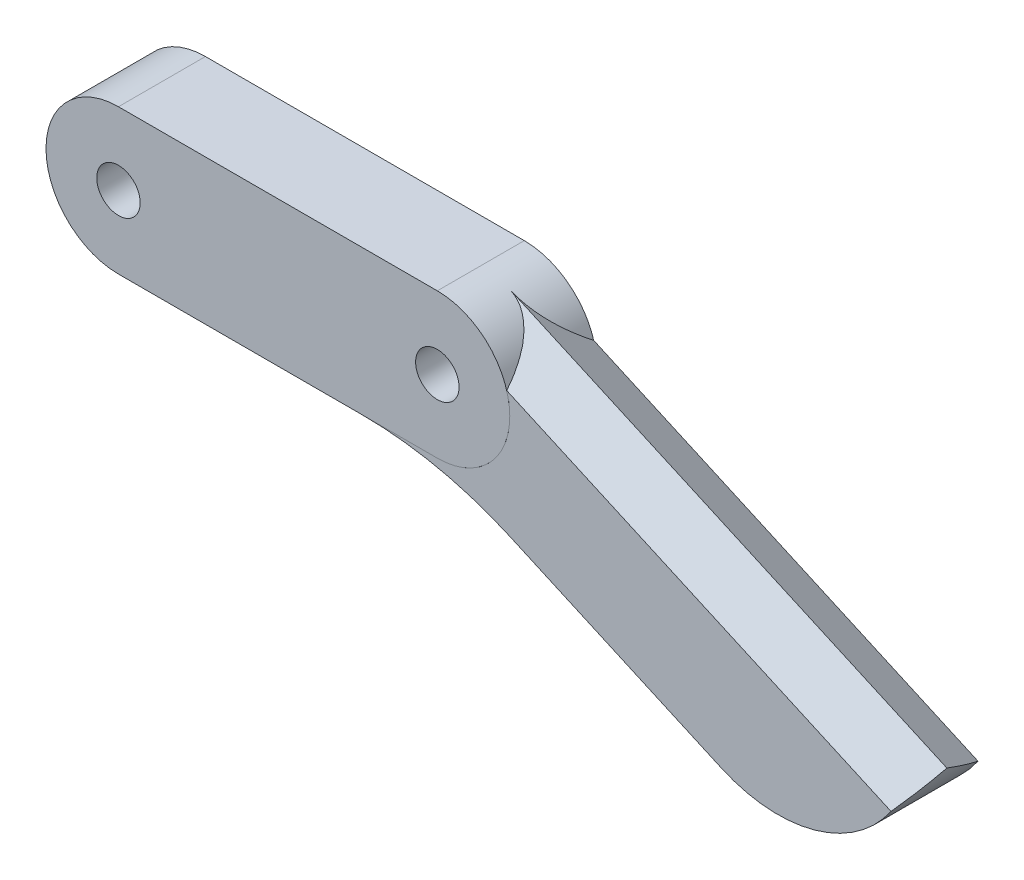
ISO-10303-21;
HEADER;
FILE_DESCRIPTION(('STEP AP214'),'2;1');
FILE_NAME('part.step','',(''),(''),'','','');
FILE_SCHEMA(('AUTOMOTIVE_DESIGN { 1 0 10303 214 1 1 1 1 }'));
ENDSEC;
DATA;
#1=APPLICATION_CONTEXT('core data for automotive mechanical design processes');
#2=APPLICATION_PROTOCOL_DEFINITION('international standard','automotive_design',2000,#1);
#3=PRODUCT_CONTEXT('',#1,'mechanical');
#4=PRODUCT('Part','Part','',(#3));
#5=PRODUCT_RELATED_PRODUCT_CATEGORY('part','',(#4));
#6=PRODUCT_DEFINITION_FORMATION('','',#4);
#7=PRODUCT_DEFINITION_CONTEXT('part definition',#1,'design');
#8=PRODUCT_DEFINITION('design','',#6,#7);
#9=PRODUCT_DEFINITION_SHAPE('','',#8);
#10=(LENGTH_UNIT() NAMED_UNIT(*) SI_UNIT(.MILLI.,.METRE.));
#11=(NAMED_UNIT(*) PLANE_ANGLE_UNIT() SI_UNIT($,.RADIAN.));
#12=(NAMED_UNIT(*) SI_UNIT($,.STERADIAN.) SOLID_ANGLE_UNIT());
#13=UNCERTAINTY_MEASURE_WITH_UNIT(LENGTH_MEASURE(1.E-05),#10,'distance_accuracy_value','');
#14=(GEOMETRIC_REPRESENTATION_CONTEXT(3) GLOBAL_UNCERTAINTY_ASSIGNED_CONTEXT((#13)) GLOBAL_UNIT_ASSIGNED_CONTEXT((#10,
#11,#12)) REPRESENTATION_CONTEXT('',''));
#15=CARTESIAN_POINT('',(0.,0.,0.));
#16=DIRECTION('',(0.,0.,1.));
#17=DIRECTION('',(1.,0.,0.));
#18=AXIS2_PLACEMENT_3D('',#15,#16,#17);
#19=CARTESIAN_POINT('',(11.,0.,0.));
#20=DIRECTION('',(0.,0.,1.));
#21=DIRECTION('',(1.,0.,0.));
#22=AXIS2_PLACEMENT_3D('',#19,#20,#21);
#23=CYLINDRICAL_SURFACE('',#22,5.);
#24=CARTESIAN_POINT('',(11.,0.,6.));
#25=DIRECTION('',(0.,0.,-1.));
#26=DIRECTION('',(1.,0.,0.));
#27=AXIS2_PLACEMENT_3D('',#24,#25,#26);
#28=CIRCLE('',#27,5.);
#29=CARTESIAN_POINT('',(15.789987511183,1.43388271581429,6.));
#30=VERTEX_POINT('',#29);
#31=CARTESIAN_POINT('',(11.,-5.,6.));
#32=VERTEX_POINT('',#31);
#33=EDGE_CURVE('E143',#30,#32,#28,.T.);
#34=ORIENTED_EDGE('',*,*,#33,.F.);
#35=CARTESIAN_POINT('',(11.,0.,11.6602540378444));
#36=DIRECTION('',(0.354283119729998,0.790242665941533,0.499999999999998));
#37=DIRECTION('',(-0.204545454545454,-0.456246815906469,0.86602540378444));
#38=AXIS2_PLACEMENT_3D('',#35,#36,#37);
#39=ELLIPSE('',#38,10.,5.);
#40=CARTESIAN_POINT('',(13.0454545454545,4.56246815906471,3.));
#41=VERTEX_POINT('',#40);
#42=EDGE_CURVE('E146',#30,#41,#39,.T.);
#43=ORIENTED_EDGE('',*,*,#42,.T.);
#44=CARTESIAN_POINT('',(11.,0.,-5.66025403784443));
#45=DIRECTION('',(0.354283119729998,0.790242665941533,-0.499999999999998));
#46=DIRECTION('',(0.204545454545454,0.456246815906469,0.86602540378444));
#47=AXIS2_PLACEMENT_3D('',#44,#45,#46);
#48=ELLIPSE('',#47,10.,5.);
#49=CARTESIAN_POINT('',(15.789987511183,1.43388271581428,0.));
#50=VERTEX_POINT('',#49);
#51=EDGE_CURVE('E136',#41,#50,#48,.T.);
#52=ORIENTED_EDGE('',*,*,#51,.T.);
#53=CARTESIAN_POINT('',(11.,0.,0.));
#54=DIRECTION('',(0.,0.,-1.));
#55=DIRECTION('',(1.,0.,0.));
#56=AXIS2_PLACEMENT_3D('',#53,#54,#55);
#57=CIRCLE('',#56,5.);
#58=CARTESIAN_POINT('',(11.,-5.,0.));
#59=VERTEX_POINT('',#58);
#60=EDGE_CURVE('E155',#50,#59,#57,.T.);
#61=ORIENTED_EDGE('',*,*,#60,.T.);
#62=DIRECTION('',(0.,0.,1.));
#63=VECTOR('',#62,1.);
#64=CARTESIAN_POINT('',(11.,-5.,0.));
#65=LINE('',#64,#63);
#66=EDGE_CURVE('E170',#59,#32,#65,.T.);
#67=ORIENTED_EDGE('',*,*,#66,.T.);
#68=EDGE_LOOP('',(#34,#43,#52,#61,#67));
#69=FACE_BOUND('',#68,.T.);
#70=ADVANCED_FACE('F77',(#69),#23,.F.);
#71=CARTESIAN_POINT('',(34.4890548930587,-5.05116820457165,0.));
#72=DIRECTION('',(0.,0.,1.));
#73=DIRECTION('',(1.,0.,0.));
#74=AXIS2_PLACEMENT_3D('',#71,#72,#73);
#75=CYLINDRICAL_SURFACE('',#74,9.49999999999999);
#76=CARTESIAN_POINT('',(34.4890548930587,-5.05116820457165,3.00000000000002));
#77=DIRECTION('',(0.354283119729998,0.790242665941533,-0.499999999999998));
#78=DIRECTION('',(0.204545454545454,0.456246815906469,0.86602540378444));
#79=AXIS2_PLACEMENT_3D('',#76,#77,#78);
#80=ELLIPSE('',#79,19.0000000000001,9.49999999999999);
#81=CARTESIAN_POINT('',(42.3038825669206,-10.4528779735098,0.));
#82=VERTEX_POINT('',#81);
#83=CARTESIAN_POINT('',(43.1577443952816,-8.93753184093531,2.99999999999996));
#84=VERTEX_POINT('',#83);
#85=EDGE_CURVE('E149',#82,#84,#80,.F.);
#86=ORIENTED_EDGE('',*,*,#85,.T.);
#87=CARTESIAN_POINT('',(34.4890548930587,-5.05116820457165,2.99999999999999));
#88=DIRECTION('',(0.354283119729998,0.790242665941533,0.499999999999998));
#89=DIRECTION('',(-0.204545454545454,-0.456246815906469,0.86602540378444));
#90=AXIS2_PLACEMENT_3D('',#87,#88,#89);
#91=ELLIPSE('',#90,19.0000000000001,9.49999999999999);
#92=CARTESIAN_POINT('',(42.3038825669206,-10.4528779735098,6.));
#93=VERTEX_POINT('',#92);
#94=EDGE_CURVE('E91',#84,#93,#91,.F.);
#95=ORIENTED_EDGE('',*,*,#94,.T.);
#96=CARTESIAN_POINT('',(34.4890548930587,-5.05116820457165,6.));
#97=DIRECTION('',(0.,0.,1.));
#98=DIRECTION('',(-1.,0.,0.));
#99=AXIS2_PLACEMENT_3D('',#96,#97,#98);
#100=CIRCLE('',#99,9.49999999999999);
#101=CARTESIAN_POINT('',(30.602691256695,-13.7198577067946,6.));
#102=VERTEX_POINT('',#101);
#103=EDGE_CURVE('E158',#102,#93,#100,.T.);
#104=ORIENTED_EDGE('',*,*,#103,.F.);
#105=DIRECTION('',(0.,0.,1.));
#106=VECTOR('',#105,1.);
#107=CARTESIAN_POINT('',(30.602691256695,-13.7198577067946,0.));
#108=LINE('',#107,#106);
#109=CARTESIAN_POINT('',(30.602691256695,-13.7198577067946,0.));
#110=VERTEX_POINT('',#109);
#111=EDGE_CURVE('E84',#110,#102,#108,.T.);
#112=ORIENTED_EDGE('',*,*,#111,.F.);
#113=CARTESIAN_POINT('',(34.4890548930587,-5.05116820457165,0.));
#114=DIRECTION('',(0.,0.,1.));
#115=DIRECTION('',(-1.,0.,0.));
#116=AXIS2_PLACEMENT_3D('',#113,#114,#115);
#117=CIRCLE('',#116,9.49999999999999);
#118=EDGE_CURVE('E167',#110,#82,#117,.T.);
#119=ORIENTED_EDGE('',*,*,#118,.T.);
#120=EDGE_LOOP('',(#86,#95,#104,#112,#119));
#121=FACE_BOUND('',#120,.T.);
#122=ADVANCED_FACE('F201',(#121),#75,.T.);
#123=CARTESIAN_POINT('',(11.,0.,6.));
#124=DIRECTION('',(0.,0.,1.));
#125=DIRECTION('',(1.,0.,0.));
#126=AXIS2_PLACEMENT_3D('',#123,#124,#125);
#127=PLANE('',#126);
#128=ORIENTED_EDGE('',*,*,#103,.T.);
#129=DIRECTION('',(-0.912493631812942,0.409090909090909,0.));
#130=VECTOR('',#129,1.);
#131=CARTESIAN_POINT('',(12.3368883059946,2.98198282718166,6.));
#132=LINE('',#131,#130);
#133=EDGE_CURVE('E98',#93,#30,#132,.T.);
#134=ORIENTED_EDGE('',*,*,#133,.T.);
#135=ORIENTED_EDGE('',*,*,#33,.T.);
#136=DIRECTION('',(-1.,0.,0.));
#137=VECTOR('',#136,1.);
#138=CARTESIAN_POINT('',(5.80508855517145,-4.99999999999999,6.));
#139=LINE('',#138,#137);
#140=CARTESIAN_POINT('',(5.80508855517145,-4.99999999999996,6.));
#141=VERTEX_POINT('',#140);
#142=EDGE_CURVE('E172',#32,#141,#139,.T.);
#143=ORIENTED_EDGE('',*,*,#142,.T.);
#144=CARTESIAN_POINT('',(5.8050885551713,-30.,6.));
#145=DIRECTION('',(0.,0.,-1.));
#146=DIRECTION('',(1.,0.,0.));
#147=AXIS2_PLACEMENT_3D('',#144,#145,#146);
#148=CIRCLE('',#147,25.);
#149=CARTESIAN_POINT('',(16.0323612824443,-7.18765920467646,6.));
#150=VERTEX_POINT('',#149);
#151=EDGE_CURVE('E175',#141,#150,#148,.T.);
#152=ORIENTED_EDGE('',*,*,#151,.T.);
#153=DIRECTION('',(0.912493631812941,-0.409090909090913,0.));
#154=VECTOR('',#153,1.);
#155=CARTESIAN_POINT('',(30.602691256695,-13.7198577067946,6.));
#156=LINE('',#155,#154);
#157=EDGE_CURVE('E178',#150,#102,#156,.T.);
#158=ORIENTED_EDGE('',*,*,#157,.T.);
#159=EDGE_LOOP('',(#128,#134,#135,#143,#152,#158));
#160=FACE_BOUND('',#159,.T.);
#161=ADVANCED_FACE('F192',(#160),#127,.T.);
#162=CARTESIAN_POINT('',(11.,0.,0.));
#163=DIRECTION('',(0.,0.,1.));
#164=DIRECTION('',(1.,0.,0.));
#165=AXIS2_PLACEMENT_3D('',#162,#163,#164);
#166=PLANE('',#165);
#167=DIRECTION('',(-0.912493631812942,0.409090909090909,0.));
#168=VECTOR('',#167,1.);
#169=CARTESIAN_POINT('',(12.3368883059946,2.98198282718166,0.));
#170=LINE('',#169,#168);
#171=EDGE_CURVE('E14',#82,#50,#170,.T.);
#172=ORIENTED_EDGE('',*,*,#171,.F.);
#173=ORIENTED_EDGE('',*,*,#118,.F.);
#174=DIRECTION('',(0.912493631812941,-0.409090909090913,0.));
#175=VECTOR('',#174,1.);
#176=CARTESIAN_POINT('',(30.602691256695,-13.7198577067946,0.));
#177=LINE('',#176,#175);
#178=CARTESIAN_POINT('',(16.0323612824443,-7.18765920467646,0.));
#179=VERTEX_POINT('',#178);
#180=EDGE_CURVE('E164',#179,#110,#177,.T.);
#181=ORIENTED_EDGE('',*,*,#180,.F.);
#182=CARTESIAN_POINT('',(5.8050885551713,-30.,0.));
#183=DIRECTION('',(0.,0.,-1.));
#184=DIRECTION('',(1.,0.,0.));
#185=AXIS2_PLACEMENT_3D('',#182,#183,#184);
#186=CIRCLE('',#185,25.);
#187=CARTESIAN_POINT('',(5.80508855517145,-4.99999999999996,0.));
#188=VERTEX_POINT('',#187);
#189=EDGE_CURVE('E161',#188,#179,#186,.T.);
#190=ORIENTED_EDGE('',*,*,#189,.F.);
#191=DIRECTION('',(-1.,0.,0.));
#192=VECTOR('',#191,1.);
#193=CARTESIAN_POINT('',(5.80508855517145,-4.99999999999999,0.));
#194=LINE('',#193,#192);
#195=EDGE_CURVE('E157',#59,#188,#194,.T.);
#196=ORIENTED_EDGE('',*,*,#195,.F.);
#197=ORIENTED_EDGE('',*,*,#60,.F.);
#198=EDGE_LOOP('',(#172,#173,#181,#190,#196,#197));
#199=FACE_BOUND('',#198,.T.);
#200=ADVANCED_FACE('F210',(#199),#166,.F.);
#201=CARTESIAN_POINT('',(30.602691256695,-13.7198577067946,0.));
#202=DIRECTION('',(-0.409090909090912,-0.912493631812941,0.));
#203=DIRECTION('',(0.912493631812941,-0.409090909090913,0.));
#204=AXIS2_PLACEMENT_3D('',#201,#202,#203);
#205=PLANE('',#204);
#206=ORIENTED_EDGE('',*,*,#157,.F.);
#207=DIRECTION('',(0.,0.,1.));
#208=VECTOR('',#207,1.);
#209=CARTESIAN_POINT('',(16.0323612824443,-7.18765920467646,0.));
#210=LINE('',#209,#208);
#211=EDGE_CURVE('E183',#179,#150,#210,.T.);
#212=ORIENTED_EDGE('',*,*,#211,.F.);
#213=ORIENTED_EDGE('',*,*,#180,.T.);
#214=ORIENTED_EDGE('',*,*,#111,.T.);
#215=EDGE_LOOP('',(#206,#212,#213,#214));
#216=FACE_BOUND('',#215,.T.);
#217=ADVANCED_FACE('F199',(#216),#205,.T.);
#218=CARTESIAN_POINT('',(5.8050885551713,-30.,0.));
#219=DIRECTION('',(0.,0.,1.));
#220=DIRECTION('',(1.,0.,0.));
#221=AXIS2_PLACEMENT_3D('',#218,#219,#220);
#222=CYLINDRICAL_SURFACE('',#221,25.);
#223=ORIENTED_EDGE('',*,*,#151,.F.);
#224=DIRECTION('',(0.,0.,1.));
#225=VECTOR('',#224,1.);
#226=CARTESIAN_POINT('',(5.80508855517145,-4.99999999999996,0.));
#227=LINE('',#226,#225);
#228=EDGE_CURVE('E185',#188,#141,#227,.T.);
#229=ORIENTED_EDGE('',*,*,#228,.F.);
#230=ORIENTED_EDGE('',*,*,#189,.T.);
#231=ORIENTED_EDGE('',*,*,#211,.T.);
#232=EDGE_LOOP('',(#223,#229,#230,#231));
#233=FACE_BOUND('',#232,.T.);
#234=ADVANCED_FACE('F195',(#233),#222,.F.);
#235=CARTESIAN_POINT('',(5.80508855517145,-4.99999999999999,0.));
#236=DIRECTION('',(0.,1.,0.));
#237=DIRECTION('',(-1.,0.,0.));
#238=AXIS2_PLACEMENT_3D('',#235,#236,#237);
#239=PLANE('',#238);
#240=ORIENTED_EDGE('',*,*,#142,.F.);
#241=ORIENTED_EDGE('',*,*,#66,.F.);
#242=ORIENTED_EDGE('',*,*,#195,.T.);
#243=ORIENTED_EDGE('',*,*,#228,.T.);
#244=EDGE_LOOP('',(#240,#241,#242,#243));
#245=FACE_BOUND('',#244,.T.);
#246=ADVANCED_FACE('F190',(#245),#239,.T.);
#247=CARTESIAN_POINT('',(2.38334804767774,5.31615312775494,-3.36362066797608));
#248=DIRECTION('',(0.354283119729998,0.790242665941533,-0.499999999999998));
#249=DIRECTION('',(0.,0.534680323038039,0.845054407808124));
#250=AXIS2_PLACEMENT_3D('',#247,#248,#249);
#251=PLANE('',#250);
#252=ORIENTED_EDGE('',*,*,#51,.F.);
#253=DIRECTION('',(-0.912493631812942,0.409090909090909,0.));
#254=VECTOR('',#253,1.);
#255=CARTESIAN_POINT('',(34.9453017089652,-5.2557136591171,3.));
#256=LINE('',#255,#254);
#257=EDGE_CURVE('E141',#84,#41,#256,.T.);
#258=ORIENTED_EDGE('',*,*,#257,.F.);
#259=ORIENTED_EDGE('',*,*,#85,.F.);
#260=ORIENTED_EDGE('',*,*,#171,.T.);
#261=EDGE_LOOP('',(#252,#258,#259,#260));
#262=FACE_BOUND('',#261,.T.);
#263=ADVANCED_FACE('F138',(#262),#251,.T.);
#264=CARTESIAN_POINT('',(3.44619740686773,7.68688112557953,4.86362066797607));
#265=DIRECTION('',(0.354283119729998,0.790242665941533,0.499999999999998));
#266=DIRECTION('',(0.,-0.534680323038039,0.845054407808124));
#267=AXIS2_PLACEMENT_3D('',#264,#265,#266);
#268=PLANE('',#267);
#269=ORIENTED_EDGE('',*,*,#42,.F.);
#270=ORIENTED_EDGE('',*,*,#133,.F.);
#271=ORIENTED_EDGE('',*,*,#94,.F.);
#272=ORIENTED_EDGE('',*,*,#257,.T.);
#273=EDGE_LOOP('',(#269,#270,#271,#272));
#274=FACE_BOUND('',#273,.T.);
#275=ADVANCED_FACE('F151',(#274),#268,.T.);
#276=CLOSED_SHELL('',(#70,#122,#161,#200,#217,#234,#246,#263,#275));
#277=MANIFOLD_SOLID_BREP('B2',#276);
#278=CARTESIAN_POINT('',(-11.,0.,6.));
#279=DIRECTION('',(0.,0.,1.));
#280=DIRECTION('',(1.,0.,0.));
#281=AXIS2_PLACEMENT_3D('',#278,#279,#280);
#282=PLANE('',#281);
#283=CARTESIAN_POINT('',(-11.,0.,6.));
#284=DIRECTION('',(0.,0.,1.));
#285=DIRECTION('',(1.,0.,0.));
#286=AXIS2_PLACEMENT_3D('',#283,#284,#285);
#287=CIRCLE('',#286,1.5);
#288=CARTESIAN_POINT('',(-9.5,0.,6.));
#289=VERTEX_POINT('',#288);
#290=EDGE_CURVE('E345',#289,#289,#287,.T.);
#291=ORIENTED_EDGE('',*,*,#290,.F.);
#292=EDGE_LOOP('',(#291));
#293=FACE_BOUND('',#292,.T.);
#294=CARTESIAN_POINT('',(-11.,0.,6.));
#295=DIRECTION('',(0.,0.,1.));
#296=DIRECTION('',(1.,0.,0.));
#297=AXIS2_PLACEMENT_3D('',#294,#295,#296);
#298=CIRCLE('',#297,5.);
#299=CARTESIAN_POINT('',(-11.,5.,6.));
#300=VERTEX_POINT('',#299);
#301=CARTESIAN_POINT('',(-11.,-5.,6.));
#302=VERTEX_POINT('',#301);
#303=EDGE_CURVE('E329',#300,#302,#298,.T.);
#304=ORIENTED_EDGE('',*,*,#303,.T.);
#305=DIRECTION('',(1.,0.,0.));
#306=VECTOR('',#305,1.);
#307=CARTESIAN_POINT('',(-11.,-5.,6.));
#308=LINE('',#307,#306);
#309=CARTESIAN_POINT('',(11.,-5.,6.));
#310=VERTEX_POINT('',#309);
#311=EDGE_CURVE('E322',#302,#310,#308,.T.);
#312=ORIENTED_EDGE('',*,*,#311,.T.);
#313=CARTESIAN_POINT('',(11.,0.,6.));
#314=DIRECTION('',(0.,0.,1.));
#315=DIRECTION('',(1.,0.,0.));
#316=AXIS2_PLACEMENT_3D('',#313,#314,#315);
#317=CIRCLE('',#316,5.);
#318=CARTESIAN_POINT('',(11.,5.,6.));
#319=VERTEX_POINT('',#318);
#320=EDGE_CURVE('E328',#310,#319,#317,.T.);
#321=ORIENTED_EDGE('',*,*,#320,.T.);
#322=DIRECTION('',(1.,0.,0.));
#323=VECTOR('',#322,1.);
#324=CARTESIAN_POINT('',(-11.,5.,6.));
#325=LINE('',#324,#323);
#326=EDGE_CURVE('E338',#300,#319,#325,.T.);
#327=ORIENTED_EDGE('',*,*,#326,.F.);
#328=EDGE_LOOP('',(#304,#312,#321,#327));
#329=FACE_BOUND('',#328,.T.);
#330=CARTESIAN_POINT('',(11.,0.,6.));
#331=DIRECTION('',(0.,0.,1.));
#332=DIRECTION('',(1.,0.,0.));
#333=AXIS2_PLACEMENT_3D('',#330,#331,#332);
#334=CIRCLE('',#333,1.5);
#335=CARTESIAN_POINT('',(12.5,0.,6.));
#336=VERTEX_POINT('',#335);
#337=EDGE_CURVE('E358',#336,#336,#334,.T.);
#338=ORIENTED_EDGE('',*,*,#337,.F.);
#339=EDGE_LOOP('',(#338));
#340=FACE_BOUND('',#339,.T.);
#341=ADVANCED_FACE('F279',(#293,#329,#340),#282,.T.);
#342=CARTESIAN_POINT('',(-11.,0.,0.));
#343=DIRECTION('',(0.,0.,1.));
#344=DIRECTION('',(1.,0.,0.));
#345=AXIS2_PLACEMENT_3D('',#342,#343,#344);
#346=PLANE('',#345);
#347=CARTESIAN_POINT('',(-11.,0.,0.));
#348=DIRECTION('',(0.,0.,1.));
#349=DIRECTION('',(1.,0.,0.));
#350=AXIS2_PLACEMENT_3D('',#347,#348,#349);
#351=CIRCLE('',#350,1.5);
#352=CARTESIAN_POINT('',(-9.5,0.,0.));
#353=VERTEX_POINT('',#352);
#354=EDGE_CURVE('E355',#353,#353,#351,.T.);
#355=ORIENTED_EDGE('',*,*,#354,.T.);
#356=EDGE_LOOP('',(#355));
#357=FACE_BOUND('',#356,.T.);
#358=CARTESIAN_POINT('',(-11.,0.,0.));
#359=DIRECTION('',(0.,0.,1.));
#360=DIRECTION('',(1.,0.,0.));
#361=AXIS2_PLACEMENT_3D('',#358,#359,#360);
#362=CIRCLE('',#361,5.);
#363=CARTESIAN_POINT('',(-11.,5.,0.));
#364=VERTEX_POINT('',#363);
#365=CARTESIAN_POINT('',(-11.,-5.,0.));
#366=VERTEX_POINT('',#365);
#367=EDGE_CURVE('E343',#364,#366,#362,.T.);
#368=ORIENTED_EDGE('',*,*,#367,.F.);
#369=DIRECTION('',(1.,0.,0.));
#370=VECTOR('',#369,1.);
#371=CARTESIAN_POINT('',(-11.,5.,0.));
#372=LINE('',#371,#370);
#373=CARTESIAN_POINT('',(11.,5.,0.));
#374=VERTEX_POINT('',#373);
#375=EDGE_CURVE('E349',#364,#374,#372,.T.);
#376=ORIENTED_EDGE('',*,*,#375,.T.);
#377=CARTESIAN_POINT('',(11.,0.,0.));
#378=DIRECTION('',(0.,0.,1.));
#379=DIRECTION('',(1.,0.,0.));
#380=AXIS2_PLACEMENT_3D('',#377,#378,#379);
#381=CIRCLE('',#380,5.);
#382=CARTESIAN_POINT('',(11.,-5.,0.));
#383=VERTEX_POINT('',#382);
#384=EDGE_CURVE('E347',#383,#374,#381,.T.);
#385=ORIENTED_EDGE('',*,*,#384,.F.);
#386=DIRECTION('',(1.,0.,0.));
#387=VECTOR('',#386,1.);
#388=CARTESIAN_POINT('',(-11.,-5.,0.));
#389=LINE('',#388,#387);
#390=EDGE_CURVE('E334',#366,#383,#389,.T.);
#391=ORIENTED_EDGE('',*,*,#390,.F.);
#392=EDGE_LOOP('',(#368,#376,#385,#391));
#393=FACE_BOUND('',#392,.T.);
#394=CARTESIAN_POINT('',(11.,0.,0.));
#395=DIRECTION('',(0.,0.,1.));
#396=DIRECTION('',(1.,0.,0.));
#397=AXIS2_PLACEMENT_3D('',#394,#395,#396);
#398=CIRCLE('',#397,1.5);
#399=CARTESIAN_POINT('',(12.5,0.,0.));
#400=VERTEX_POINT('',#399);
#401=EDGE_CURVE('E361',#400,#400,#398,.T.);
#402=ORIENTED_EDGE('',*,*,#401,.T.);
#403=EDGE_LOOP('',(#402));
#404=FACE_BOUND('',#403,.T.);
#405=ADVANCED_FACE('F370',(#357,#393,#404),#346,.F.);
#406=CARTESIAN_POINT('',(-11.,0.,6.));
#407=DIRECTION('',(0.,0.,-1.));
#408=DIRECTION('',(-1.,0.,0.));
#409=AXIS2_PLACEMENT_3D('',#406,#407,#408);
#410=CYLINDRICAL_SURFACE('',#409,5.);
#411=ORIENTED_EDGE('',*,*,#367,.T.);
#412=DIRECTION('',(0.,0.,-1.));
#413=VECTOR('',#412,1.);
#414=CARTESIAN_POINT('',(-11.,-5.,6.));
#415=LINE('',#414,#413);
#416=EDGE_CURVE('E75',#302,#366,#415,.T.);
#417=ORIENTED_EDGE('',*,*,#416,.F.);
#418=ORIENTED_EDGE('',*,*,#303,.F.);
#419=DIRECTION('',(0.,0.,-1.));
#420=VECTOR('',#419,1.);
#421=CARTESIAN_POINT('',(-11.,5.,6.));
#422=LINE('',#421,#420);
#423=EDGE_CURVE('E296',#300,#364,#422,.T.);
#424=ORIENTED_EDGE('',*,*,#423,.T.);
#425=EDGE_LOOP('',(#411,#417,#418,#424));
#426=FACE_BOUND('',#425,.T.);
#427=ADVANCED_FACE('F281',(#426),#410,.T.);
#428=CARTESIAN_POINT('',(-11.,-5.,6.));
#429=DIRECTION('',(0.,1.,0.));
#430=DIRECTION('',(-1.,0.,0.));
#431=AXIS2_PLACEMENT_3D('',#428,#429,#430);
#432=PLANE('',#431);
#433=ORIENTED_EDGE('',*,*,#390,.T.);
#434=DIRECTION('',(0.,0.,-1.));
#435=VECTOR('',#434,1.);
#436=CARTESIAN_POINT('',(11.,-5.,6.));
#437=LINE('',#436,#435);
#438=EDGE_CURVE('E288',#310,#383,#437,.T.);
#439=ORIENTED_EDGE('',*,*,#438,.F.);
#440=ORIENTED_EDGE('',*,*,#311,.F.);
#441=ORIENTED_EDGE('',*,*,#416,.T.);
#442=EDGE_LOOP('',(#433,#439,#440,#441));
#443=FACE_BOUND('',#442,.T.);
#444=ADVANCED_FACE('F333',(#443),#432,.F.);
#445=CARTESIAN_POINT('',(11.,0.,6.));
#446=DIRECTION('',(0.,0.,-1.));
#447=DIRECTION('',(-1.,0.,0.));
#448=AXIS2_PLACEMENT_3D('',#445,#446,#447);
#449=CYLINDRICAL_SURFACE('',#448,5.);
#450=ORIENTED_EDGE('',*,*,#384,.T.);
#451=DIRECTION('',(0.,0.,-1.));
#452=VECTOR('',#451,1.);
#453=CARTESIAN_POINT('',(11.,5.,6.));
#454=LINE('',#453,#452);
#455=EDGE_CURVE('E311',#319,#374,#454,.T.);
#456=ORIENTED_EDGE('',*,*,#455,.F.);
#457=ORIENTED_EDGE('',*,*,#320,.F.);
#458=ORIENTED_EDGE('',*,*,#438,.T.);
#459=EDGE_LOOP('',(#450,#456,#457,#458));
#460=FACE_BOUND('',#459,.T.);
#461=ADVANCED_FACE('F337',(#460),#449,.T.);
#462=CARTESIAN_POINT('',(-11.,5.,6.));
#463=DIRECTION('',(0.,1.,0.));
#464=DIRECTION('',(-1.,0.,0.));
#465=AXIS2_PLACEMENT_3D('',#462,#463,#464);
#466=PLANE('',#465);
#467=ORIENTED_EDGE('',*,*,#375,.F.);
#468=ORIENTED_EDGE('',*,*,#423,.F.);
#469=ORIENTED_EDGE('',*,*,#326,.T.);
#470=ORIENTED_EDGE('',*,*,#455,.T.);
#471=EDGE_LOOP('',(#467,#468,#469,#470));
#472=FACE_BOUND('',#471,.T.);
#473=ADVANCED_FACE('F383',(#472),#466,.T.);
#474=CARTESIAN_POINT('',(-11.,0.,6.));
#475=DIRECTION('',(0.,0.,-1.));
#476=DIRECTION('',(-1.,0.,0.));
#477=AXIS2_PLACEMENT_3D('',#474,#475,#476);
#478=CYLINDRICAL_SURFACE('',#477,1.5);
#479=ORIENTED_EDGE('',*,*,#290,.T.);
#480=EDGE_LOOP('',(#479));
#481=FACE_BOUND('',#480,.T.);
#482=ORIENTED_EDGE('',*,*,#354,.F.);
#483=EDGE_LOOP('',(#482));
#484=FACE_BOUND('',#483,.T.);
#485=ADVANCED_FACE('F380',(#481,#484),#478,.F.);
#486=CARTESIAN_POINT('',(11.,0.,6.));
#487=DIRECTION('',(0.,0.,-1.));
#488=DIRECTION('',(-1.,0.,0.));
#489=AXIS2_PLACEMENT_3D('',#486,#487,#488);
#490=CYLINDRICAL_SURFACE('',#489,1.5);
#491=ORIENTED_EDGE('',*,*,#337,.T.);
#492=EDGE_LOOP('',(#491));
#493=FACE_BOUND('',#492,.T.);
#494=ORIENTED_EDGE('',*,*,#401,.F.);
#495=EDGE_LOOP('',(#494));
#496=FACE_BOUND('',#495,.T.);
#497=ADVANCED_FACE('F367',(#493,#496),#490,.F.);
#498=CLOSED_SHELL('',(#341,#405,#427,#444,#461,#473,#485,#497));
#499=MANIFOLD_SOLID_BREP('B8',#498);
#500=ADVANCED_BREP_SHAPE_REPRESENTATION('',(#18,#277,#499),#14);
#501=SHAPE_DEFINITION_REPRESENTATION(#9,#500);
ENDSEC;
END-ISO-10303-21;
